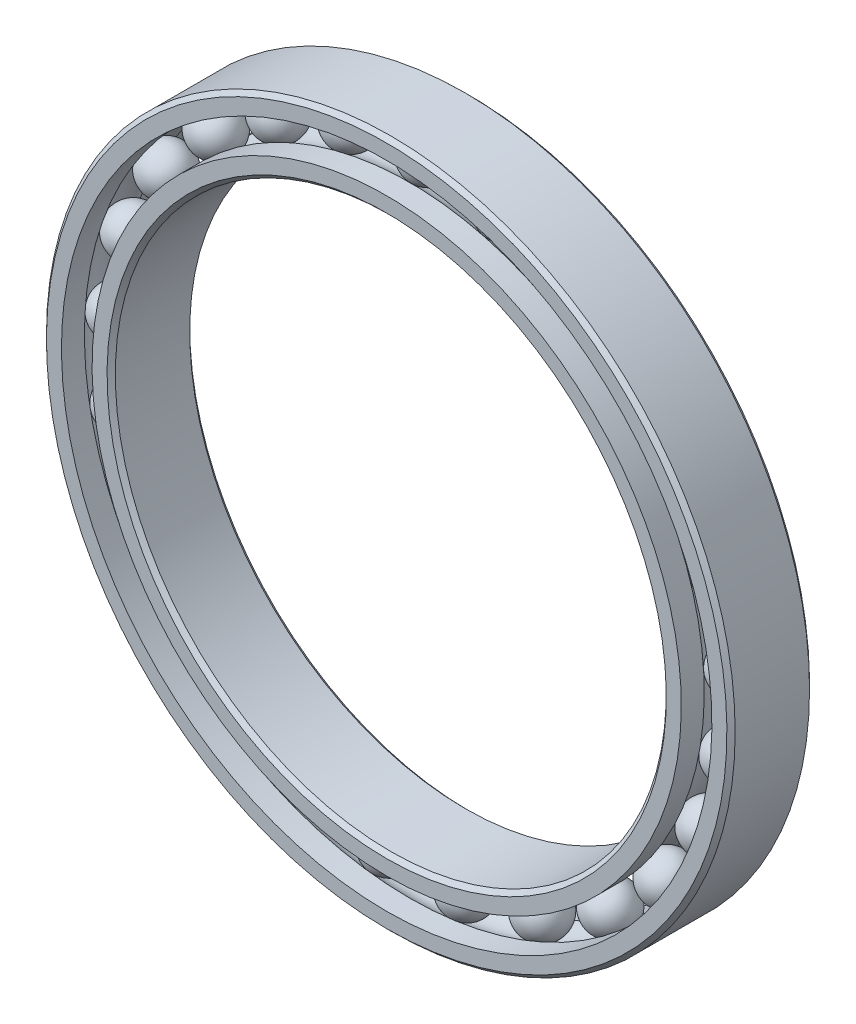
ISO-10303-21;
HEADER;
FILE_DESCRIPTION(('STEP AP214'),'2;1');
FILE_NAME('part.step','',(''),(''),'','','');
FILE_SCHEMA(('AUTOMOTIVE_DESIGN { 1 0 10303 214 1 1 1 1 }'));
ENDSEC;
DATA;
#1=APPLICATION_CONTEXT('core data for automotive mechanical design processes');
#2=APPLICATION_PROTOCOL_DEFINITION('international standard','automotive_design',2000,#1);
#3=PRODUCT_CONTEXT('',#1,'mechanical');
#4=PRODUCT('Part','Part','',(#3));
#5=PRODUCT_RELATED_PRODUCT_CATEGORY('part','',(#4));
#6=PRODUCT_DEFINITION_FORMATION('','',#4);
#7=PRODUCT_DEFINITION_CONTEXT('part definition',#1,'design');
#8=PRODUCT_DEFINITION('design','',#6,#7);
#9=PRODUCT_DEFINITION_SHAPE('','',#8);
#10=(LENGTH_UNIT() NAMED_UNIT(*) SI_UNIT(.MILLI.,.METRE.));
#11=(NAMED_UNIT(*) PLANE_ANGLE_UNIT() SI_UNIT($,.RADIAN.));
#12=(NAMED_UNIT(*) SI_UNIT($,.STERADIAN.) SOLID_ANGLE_UNIT());
#13=UNCERTAINTY_MEASURE_WITH_UNIT(LENGTH_MEASURE(1.E-05),#10,'distance_accuracy_value','');
#14=(GEOMETRIC_REPRESENTATION_CONTEXT(3) GLOBAL_UNCERTAINTY_ASSIGNED_CONTEXT((#13)) GLOBAL_UNIT_ASSIGNED_CONTEXT((#10,
#11,#12)) REPRESENTATION_CONTEXT('',''));
#15=CARTESIAN_POINT('',(0.,0.,0.));
#16=DIRECTION('',(0.,0.,1.));
#17=DIRECTION('',(1.,0.,0.));
#18=AXIS2_PLACEMENT_3D('',#15,#16,#17);
#19=CARTESIAN_POINT('',(5.59552246120893,21.7931211253943,0.));
#20=DIRECTION('',(0.,0.,1.));
#21=DIRECTION('',(0.248689887164842,0.968583161128635,0.));
#22=AXIS2_PLACEMENT_3D('',#19,#20,#21);
#23=SPHERICAL_SURFACE('',#22,1.73561103909037);
#24=CARTESIAN_POINT('',(5.59552246120893,21.7931211253943,1.73561103909036));
#25=VERTEX_POINT('',#24);
#26=VERTEX_LOOP('',#25);
#27=FACE_BOUND('',#26,.T.);
#28=ADVANCED_FACE('F48',(#27),#23,.T.);
#29=CLOSED_SHELL('',(#28));
#30=MANIFOLD_SOLID_BREP('B2',#29);
#31=CARTESIAN_POINT('',(10.8394576672883,19.7169003009871,0.));
#32=DIRECTION('',(0.,0.,1.));
#33=DIRECTION('',(0.481753674101704,0.87630668004387,0.));
#34=AXIS2_PLACEMENT_3D('',#31,#32,#33);
#35=SPHERICAL_SURFACE('',#34,1.73561103909037);
#36=CARTESIAN_POINT('',(10.8394576672883,19.7169003009871,1.73561103909036));
#37=VERTEX_POINT('',#36);
#38=VERTEX_LOOP('',#37);
#39=FACE_BOUND('',#38,.T.);
#40=ADVANCED_FACE('F65',(#39),#35,.T.);
#41=CLOSED_SHELL('',(#40));
#42=MANIFOLD_SOLID_BREP('B6',#41);
#43=CARTESIAN_POINT('',(15.4023098833953,16.401794116982,0.));
#44=DIRECTION('',(0.,0.,1.));
#45=DIRECTION('',(0.684547105928679,0.72896862742142,0.));
#46=AXIS2_PLACEMENT_3D('',#43,#44,#45);
#47=SPHERICAL_SURFACE('',#46,1.73561103909037);
#48=CARTESIAN_POINT('',(15.4023098833953,16.401794116982,1.73561103909036));
#49=VERTEX_POINT('',#48);
#50=VERTEX_LOOP('',#49);
#51=FACE_BOUND('',#50,.T.);
#52=ADVANCED_FACE('F82',(#51),#47,.T.);
#53=CLOSED_SHELL('',(#52));
#54=MANIFOLD_SOLID_BREP('B44',#53);
#55=CARTESIAN_POINT('',(18.9973783237952,12.0561028870276,0.));
#56=DIRECTION('',(0.,0.,1.));
#57=DIRECTION('',(0.844327925502009,0.535826794979007,0.));
#58=AXIS2_PLACEMENT_3D('',#55,#56,#57);
#59=SPHERICAL_SURFACE('',#58,1.73561103909037);
#60=CARTESIAN_POINT('',(18.9973783237952,12.0561028870276,1.73561103909036));
#61=VERTEX_POINT('',#60);
#62=VERTEX_LOOP('',#61);
#63=FACE_BOUND('',#62,.T.);
#64=ADVANCED_FACE('F99',(#63),#59,.T.);
#65=CLOSED_SHELL('',(#64));
#66=MANIFOLD_SOLID_BREP('B61',#65);
#67=CARTESIAN_POINT('',(21.3987716166409,6.95288237343656,0.));
#68=DIRECTION('',(0.,0.,1.));
#69=DIRECTION('',(0.95105651629515,0.309016994374958,0.));
#70=AXIS2_PLACEMENT_3D('',#67,#68,#69);
#71=SPHERICAL_SURFACE('',#70,1.73561103909037);
#72=CARTESIAN_POINT('',(21.3987716166409,6.95288237343656,1.73561103909036));
#73=VERTEX_POINT('',#72);
#74=VERTEX_LOOP('',#73);
#75=FACE_BOUND('',#74,.T.);
#76=ADVANCED_FACE('F116',(#75),#71,.T.);
#77=CLOSED_SHELL('',(#76));
#78=MANIFOLD_SOLID_BREP('B78',#77);
#79=CARTESIAN_POINT('',(22.4556013896361,1.4127866894098,0.));
#80=DIRECTION('',(0.,0.,1.));
#81=DIRECTION('',(0.998026728428271,0.0627905195293244,0.));
#82=AXIS2_PLACEMENT_3D('',#79,#80,#81);
#83=SPHERICAL_SURFACE('',#82,1.73561103909037);
#84=CARTESIAN_POINT('',(22.4556013896361,1.4127866894098,1.73561103909036));
#85=VERTEX_POINT('',#84);
#86=VERTEX_LOOP('',#85);
#87=FACE_BOUND('',#86,.T.);
#88=ADVANCED_FACE('F133',(#87),#83,.T.);
#89=CLOSED_SHELL('',(#88));
#90=MANIFOLD_SOLID_BREP('B95',#89);
#91=CARTESIAN_POINT('',(22.1014631413955,-4.21607957817859,0.));
#92=DIRECTION('',(0.,0.,1.));
#93=DIRECTION('',(0.982287250728691,-0.187381314585715,0.));
#94=AXIS2_PLACEMENT_3D('',#91,#92,#93);
#95=SPHERICAL_SURFACE('',#94,1.73561103909037);
#96=CARTESIAN_POINT('',(22.1014631413955,-4.21607957817859,1.73561103909036));
#97=VERTEX_POINT('',#96);
#98=VERTEX_LOOP('',#97);
#99=FACE_BOUND('',#98,.T.);
#100=ADVANCED_FACE('F150',(#99),#95,.T.);
#101=CLOSED_SHELL('',(#100));
#102=MANIFOLD_SOLID_BREP('B112',#101);
#103=CARTESIAN_POINT('',(20.3586086804855,-9.58003406021394,0.));
#104=DIRECTION('',(0.,0.,1.));
#105=DIRECTION('',(0.904827052466024,-0.425779291565064,0.));
#106=AXIS2_PLACEMENT_3D('',#103,#104,#105);
#107=SPHERICAL_SURFACE('',#106,1.73561103909037);
#108=CARTESIAN_POINT('',(20.3586086804855,-9.58003406021394,1.73561103909036));
#109=VERTEX_POINT('',#108);
#110=VERTEX_LOOP('',#109);
#111=FACE_BOUND('',#110,.T.);
#112=ADVANCED_FACE('F167',(#111),#107,.T.);
#113=CLOSED_SHELL('',(#112));
#114=MANIFOLD_SOLID_BREP('B129',#113);
#115=CARTESIAN_POINT('',(17.3365479624554,-14.3420397693454,0.));
#116=DIRECTION('',(0.,0.,1.));
#117=DIRECTION('',(0.770513242775795,-0.637423989748683,0.));
#118=AXIS2_PLACEMENT_3D('',#115,#116,#117);
#119=SPHERICAL_SURFACE('',#118,1.73561103909037);
#120=CARTESIAN_POINT('',(17.3365479624554,-14.3420397693454,1.73561103909036));
#121=VERTEX_POINT('',#120);
#122=VERTEX_LOOP('',#121);
#123=FACE_BOUND('',#122,.T.);
#124=ADVANCED_FACE('F184',(#123),#119,.T.);
#125=CLOSED_SHELL('',(#124));
#126=MANIFOLD_SOLID_BREP('B146',#125);
#127=CARTESIAN_POINT('',(13.2251681765808,-18.2028823734362,0.));
#128=DIRECTION('',(0.,0.,1.));
#129=DIRECTION('',(0.58778525229248,-0.809016994374942,0.));
#130=AXIS2_PLACEMENT_3D('',#127,#128,#129);
#131=SPHERICAL_SURFACE('',#130,1.73561103909037);
#132=CARTESIAN_POINT('',(13.2251681765808,-18.2028823734362,1.73561103909036));
#133=VERTEX_POINT('',#132);
#134=VERTEX_LOOP('',#133);
#135=FACE_BOUND('',#134,.T.);
#136=ADVANCED_FACE('F201',(#135),#131,.T.);
#137=CLOSED_SHELL('',(#136));
#138=MANIFOLD_SOLID_BREP('B163',#137);
#139=CARTESIAN_POINT('',(8.28280243540542,-20.9199709324856,0.));
#140=DIRECTION('',(0.,0.,1.));
#141=DIRECTION('',(0.368124552684685,-0.929776485888248,0.));
#142=AXIS2_PLACEMENT_3D('',#139,#140,#141);
#143=SPHERICAL_SURFACE('',#142,1.73561103909037);
#144=CARTESIAN_POINT('',(8.28280243540542,-20.9199709324856,1.73561103909036));
#145=VERTEX_POINT('',#144);
#146=VERTEX_LOOP('',#145);
#147=FACE_BOUND('',#146,.T.);
#148=ADVANCED_FACE('F218',(#147),#143,.T.);
#149=CLOSED_SHELL('',(#148));
#150=MANIFOLD_SOLID_BREP('B180',#149);
#151=CARTESIAN_POINT('',(2.81999775519701,-22.3225807795757,0.));
#152=DIRECTION('',(0.,0.,1.));
#153=DIRECTION('',(0.125333233564311,-0.992114701314477,0.));
#154=AXIS2_PLACEMENT_3D('',#151,#152,#153);
#155=SPHERICAL_SURFACE('',#154,1.73561103909037);
#156=CARTESIAN_POINT('',(2.81999775519701,-22.3225807795757,1.73561103909036));
#157=VERTEX_POINT('',#156);
#158=VERTEX_LOOP('',#157);
#159=FACE_BOUND('',#158,.T.);
#160=ADVANCED_FACE('F235',(#159),#155,.T.);
#161=CLOSED_SHELL('',(#160));
#162=MANIFOLD_SOLID_BREP('B197',#161);
#163=CARTESIAN_POINT('',(-2.81999775519669,-22.3225807795758,0.));
#164=DIRECTION('',(0.,0.,1.));
#165=DIRECTION('',(-0.125333233564297,-0.992114701314479,0.));
#166=AXIS2_PLACEMENT_3D('',#163,#164,#165);
#167=SPHERICAL_SURFACE('',#166,1.73561103909037);
#168=CARTESIAN_POINT('',(-2.81999775519669,-22.3225807795758,1.73561103909036));
#169=VERTEX_POINT('',#168);
#170=VERTEX_LOOP('',#169);
#171=FACE_BOUND('',#170,.T.);
#172=ADVANCED_FACE('F252',(#171),#167,.T.);
#173=CLOSED_SHELL('',(#172));
#174=MANIFOLD_SOLID_BREP('B214',#173);
#175=CARTESIAN_POINT('',(-8.28280243540512,-20.9199709324857,0.));
#176=DIRECTION('',(0.,0.,1.));
#177=DIRECTION('',(-0.368124552684672,-0.929776485888254,0.));
#178=AXIS2_PLACEMENT_3D('',#175,#176,#177);
#179=SPHERICAL_SURFACE('',#178,1.73561103909037);
#180=CARTESIAN_POINT('',(-8.28280243540512,-20.9199709324857,1.73561103909036));
#181=VERTEX_POINT('',#180);
#182=VERTEX_LOOP('',#181);
#183=FACE_BOUND('',#182,.T.);
#184=ADVANCED_FACE('F269',(#183),#179,.T.);
#185=CLOSED_SHELL('',(#184));
#186=MANIFOLD_SOLID_BREP('B231',#185);
#187=CARTESIAN_POINT('',(-13.2251681765805,-18.2028823734364,0.));
#188=DIRECTION('',(0.,0.,1.));
#189=DIRECTION('',(-0.587785252292469,-0.809016994374951,0.));
#190=AXIS2_PLACEMENT_3D('',#187,#188,#189);
#191=SPHERICAL_SURFACE('',#190,1.73561103909037);
#192=CARTESIAN_POINT('',(-13.2251681765805,-18.2028823734364,1.73561103909036));
#193=VERTEX_POINT('',#192);
#194=VERTEX_LOOP('',#193);
#195=FACE_BOUND('',#194,.T.);
#196=ADVANCED_FACE('F286',(#195),#191,.T.);
#197=CLOSED_SHELL('',(#196));
#198=MANIFOLD_SOLID_BREP('B248',#197);
#199=CARTESIAN_POINT('',(-17.3365479624552,-14.3420397693456,0.));
#200=DIRECTION('',(0.,0.,1.));
#201=DIRECTION('',(-0.770513242775786,-0.637423989748694,0.));
#202=AXIS2_PLACEMENT_3D('',#199,#200,#201);
#203=SPHERICAL_SURFACE('',#202,1.73561103909037);
#204=CARTESIAN_POINT('',(-17.3365479624552,-14.3420397693456,1.73561103909036));
#205=VERTEX_POINT('',#204);
#206=VERTEX_LOOP('',#205);
#207=FACE_BOUND('',#206,.T.);
#208=ADVANCED_FACE('F303',(#207),#203,.T.);
#209=CLOSED_SHELL('',(#208));
#210=MANIFOLD_SOLID_BREP('B265',#209);
#211=CARTESIAN_POINT('',(-20.3586086804854,-9.58003406021423,0.));
#212=DIRECTION('',(0.,0.,1.));
#213=DIRECTION('',(-0.904827052466018,-0.425779291565077,0.));
#214=AXIS2_PLACEMENT_3D('',#211,#212,#213);
#215=SPHERICAL_SURFACE('',#214,1.73561103909037);
#216=CARTESIAN_POINT('',(-20.3586086804854,-9.58003406021423,1.73561103909036));
#217=VERTEX_POINT('',#216);
#218=VERTEX_LOOP('',#217);
#219=FACE_BOUND('',#218,.T.);
#220=ADVANCED_FACE('F320',(#219),#215,.T.);
#221=CLOSED_SHELL('',(#220));
#222=MANIFOLD_SOLID_BREP('B282',#221);
#223=CARTESIAN_POINT('',(-22.1014631413955,-4.21607957817889,0.));
#224=DIRECTION('',(0.,0.,1.));
#225=DIRECTION('',(-0.982287250728688,-0.187381314585729,0.));
#226=AXIS2_PLACEMENT_3D('',#223,#224,#225);
#227=SPHERICAL_SURFACE('',#226,1.73561103909037);
#228=CARTESIAN_POINT('',(-22.1014631413955,-4.21607957817889,1.73561103909036));
#229=VERTEX_POINT('',#228);
#230=VERTEX_LOOP('',#229);
#231=FACE_BOUND('',#230,.T.);
#232=ADVANCED_FACE('F337',(#231),#227,.T.);
#233=CLOSED_SHELL('',(#232));
#234=MANIFOLD_SOLID_BREP('B299',#233);
#235=CARTESIAN_POINT('',(-22.4556013896361,1.41278668940947,0.));
#236=DIRECTION('',(0.,0.,1.));
#237=DIRECTION('',(-0.998026728428272,0.06279051952931,0.));
#238=AXIS2_PLACEMENT_3D('',#235,#236,#237);
#239=SPHERICAL_SURFACE('',#238,1.73561103909037);
#240=CARTESIAN_POINT('',(-22.4556013896361,1.41278668940947,1.73561103909036));
#241=VERTEX_POINT('',#240);
#242=VERTEX_LOOP('',#241);
#243=FACE_BOUND('',#242,.T.);
#244=ADVANCED_FACE('F354',(#243),#239,.T.);
#245=CLOSED_SHELL('',(#244));
#246=MANIFOLD_SOLID_BREP('B316',#245);
#247=CARTESIAN_POINT('',(-21.398771616641,6.95288237343626,0.));
#248=DIRECTION('',(0.,0.,1.));
#249=DIRECTION('',(-0.951056516295155,0.309016994374945,0.));
#250=AXIS2_PLACEMENT_3D('',#247,#248,#249);
#251=SPHERICAL_SURFACE('',#250,1.73561103909037);
#252=CARTESIAN_POINT('',(-21.398771616641,6.95288237343626,1.73561103909036));
#253=VERTEX_POINT('',#252);
#254=VERTEX_LOOP('',#253);
#255=FACE_BOUND('',#254,.T.);
#256=ADVANCED_FACE('F371',(#255),#251,.T.);
#257=CLOSED_SHELL('',(#256));
#258=MANIFOLD_SOLID_BREP('B333',#257);
#259=CARTESIAN_POINT('',(-18.9973783237954,12.0561028870274,0.));
#260=DIRECTION('',(0.,0.,1.));
#261=DIRECTION('',(-0.844327925502017,0.535826794978995,0.));
#262=AXIS2_PLACEMENT_3D('',#259,#260,#261);
#263=SPHERICAL_SURFACE('',#262,1.73561103909037);
#264=CARTESIAN_POINT('',(-18.9973783237954,12.0561028870274,1.73561103909036));
#265=VERTEX_POINT('',#264);
#266=VERTEX_LOOP('',#265);
#267=FACE_BOUND('',#266,.T.);
#268=ADVANCED_FACE('F388',(#267),#263,.T.);
#269=CLOSED_SHELL('',(#268));
#270=MANIFOLD_SOLID_BREP('B350',#269);
#271=CARTESIAN_POINT('',(-15.4023098833955,16.4017941169817,0.));
#272=DIRECTION('',(0.,0.,1.));
#273=DIRECTION('',(-0.68454710592869,0.72896862742141,0.));
#274=AXIS2_PLACEMENT_3D('',#271,#272,#273);
#275=SPHERICAL_SURFACE('',#274,1.73561103909037);
#276=CARTESIAN_POINT('',(-15.4023098833955,16.4017941169817,1.73561103909036));
#277=VERTEX_POINT('',#276);
#278=VERTEX_LOOP('',#277);
#279=FACE_BOUND('',#278,.T.);
#280=ADVANCED_FACE('F405',(#279),#275,.T.);
#281=CLOSED_SHELL('',(#280));
#282=MANIFOLD_SOLID_BREP('B367',#281);
#283=CARTESIAN_POINT('',(-10.8394576672886,19.7169003009869,0.));
#284=DIRECTION('',(0.,0.,1.));
#285=DIRECTION('',(-0.481753674101716,0.876306680043863,0.));
#286=AXIS2_PLACEMENT_3D('',#283,#284,#285);
#287=SPHERICAL_SURFACE('',#286,1.73561103909037);
#288=CARTESIAN_POINT('',(-10.8394576672886,19.7169003009869,1.73561103909036));
#289=VERTEX_POINT('',#288);
#290=VERTEX_LOOP('',#289);
#291=FACE_BOUND('',#290,.T.);
#292=ADVANCED_FACE('F422',(#291),#287,.T.);
#293=CLOSED_SHELL('',(#292));
#294=MANIFOLD_SOLID_BREP('B384',#293);
#295=CARTESIAN_POINT('',(-5.59552246120924,21.7931211253942,0.));
#296=DIRECTION('',(0.,0.,1.));
#297=DIRECTION('',(-0.248689887164855,0.968583161128631,0.));
#298=AXIS2_PLACEMENT_3D('',#295,#296,#297);
#299=SPHERICAL_SURFACE('',#298,1.73561103909037);
#300=CARTESIAN_POINT('',(-5.59552246120924,21.7931211253942,1.73561103909036));
#301=VERTEX_POINT('',#300);
#302=VERTEX_LOOP('',#301);
#303=FACE_BOUND('',#302,.T.);
#304=ADVANCED_FACE('F439',(#303),#299,.T.);
#305=CLOSED_SHELL('',(#304));
#306=MANIFOLD_SOLID_BREP('B401',#305);
#307=CARTESIAN_POINT('',(0.,22.5,0.));
#308=DIRECTION('',(0.,0.,1.));
#309=DIRECTION('',(0.,1.,0.));
#310=AXIS2_PLACEMENT_3D('',#307,#308,#309);
#311=SPHERICAL_SURFACE('',#310,1.73561103909037);
#312=CARTESIAN_POINT('',(0.,22.5,1.73561103909036));
#313=VERTEX_POINT('',#312);
#314=VERTEX_LOOP('',#313);
#315=FACE_BOUND('',#314,.T.);
#316=ADVANCED_FACE('F458',(#315),#311,.T.);
#317=CLOSED_SHELL('',(#316));
#318=MANIFOLD_SOLID_BREP('B418',#317);
#319=CARTESIAN_POINT('',(0.,21.3888888888889,3.));
#320=DIRECTION('',(0.,0.,-1.));
#321=DIRECTION('',(0.,1.,0.));
#322=AXIS2_PLACEMENT_3D('',#319,#320,#321);
#323=PLANE('',#322);
#324=CARTESIAN_POINT('',(0.,0.,3.));
#325=DIRECTION('',(0.,0.,1.));
#326=DIRECTION('',(0.,-1.,0.));
#327=AXIS2_PLACEMENT_3D('',#324,#325,#326);
#328=CIRCLE('',#327,20.3);
#329=CARTESIAN_POINT('',(0.,-20.3,3.));
#330=VERTEX_POINT('',#329);
#331=EDGE_CURVE('E504',#330,#330,#328,.T.);
#332=ORIENTED_EDGE('',*,*,#331,.F.);
#333=EDGE_LOOP('',(#332));
#334=FACE_BOUND('',#333,.T.);
#335=CARTESIAN_POINT('',(0.,0.,3.));
#336=DIRECTION('',(0.,0.,1.));
#337=DIRECTION('',(0.,-1.,0.));
#338=AXIS2_PLACEMENT_3D('',#335,#336,#337);
#339=CIRCLE('',#338,21.3888888888889);
#340=CARTESIAN_POINT('',(0.,-21.3888888888889,3.));
#341=VERTEX_POINT('',#340);
#342=EDGE_CURVE('E457',#341,#341,#339,.T.);
#343=ORIENTED_EDGE('',*,*,#342,.T.);
#344=EDGE_LOOP('',(#343));
#345=FACE_BOUND('',#344,.T.);
#346=ADVANCED_FACE('F476',(#334,#345),#323,.F.);
#347=CARTESIAN_POINT('',(0.,0.,2.99999999999999));
#348=DIRECTION('',(0.,0.,1.));
#349=DIRECTION('',(0.,-1.,0.));
#350=AXIS2_PLACEMENT_3D('',#347,#348,#349);
#351=CYLINDRICAL_SURFACE('',#350,21.3888888888889);
#352=ORIENTED_EDGE('',*,*,#342,.F.);
#353=EDGE_LOOP('',(#352));
#354=FACE_BOUND('',#353,.T.);
#355=CARTESIAN_POINT('',(0.,0.,1.33333333333333));
#356=DIRECTION('',(0.,0.,1.));
#357=DIRECTION('',(0.,-1.,0.));
#358=AXIS2_PLACEMENT_3D('',#355,#356,#357);
#359=CIRCLE('',#358,21.3888888888889);
#360=CARTESIAN_POINT('',(0.,-21.3888888888889,1.33333333333332));
#361=VERTEX_POINT('',#360);
#362=EDGE_CURVE('E482',#361,#361,#359,.T.);
#363=ORIENTED_EDGE('',*,*,#362,.T.);
#364=EDGE_LOOP('',(#363));
#365=FACE_BOUND('',#364,.T.);
#366=ADVANCED_FACE('F511',(#354,#365),#351,.T.);
#367=CARTESIAN_POINT('',(0.,0.,0.));
#368=DIRECTION('',(0.,0.,1.));
#369=DIRECTION('',(0.,-1.,0.));
#370=AXIS2_PLACEMENT_3D('',#367,#368,#369);
#371=TOROIDAL_SURFACE('',#370,22.5,1.73561103909037);
#372=ORIENTED_EDGE('',*,*,#362,.F.);
#373=EDGE_LOOP('',(#372));
#374=FACE_BOUND('',#373,.T.);
#375=CARTESIAN_POINT('',(0.,0.,-1.33333333333333));
#376=DIRECTION('',(0.,0.,1.));
#377=DIRECTION('',(0.,-1.,0.));
#378=AXIS2_PLACEMENT_3D('',#375,#376,#377);
#379=CIRCLE('',#378,21.3888888888889);
#380=CARTESIAN_POINT('',(0.,-21.3888888888889,-1.33333333333333));
#381=VERTEX_POINT('',#380);
#382=EDGE_CURVE('E486',#381,#381,#379,.T.);
#383=ORIENTED_EDGE('',*,*,#382,.T.);
#384=EDGE_LOOP('',(#383));
#385=FACE_BOUND('',#384,.T.);
#386=ADVANCED_FACE('F515',(#374,#385),#371,.F.);
#387=CARTESIAN_POINT('',(0.,0.,2.99999999999999));
#388=DIRECTION('',(0.,0.,1.));
#389=DIRECTION('',(0.,-1.,0.));
#390=AXIS2_PLACEMENT_3D('',#387,#388,#389);
#391=CYLINDRICAL_SURFACE('',#390,21.3888888888889);
#392=ORIENTED_EDGE('',*,*,#382,.F.);
#393=EDGE_LOOP('',(#392));
#394=FACE_BOUND('',#393,.T.);
#395=CARTESIAN_POINT('',(0.,0.,-3.00000000000001));
#396=DIRECTION('',(0.,0.,1.));
#397=DIRECTION('',(0.,-1.,0.));
#398=AXIS2_PLACEMENT_3D('',#395,#396,#397);
#399=CIRCLE('',#398,21.3888888888889);
#400=CARTESIAN_POINT('',(0.,-21.3888888888889,-3.00000000000001));
#401=VERTEX_POINT('',#400);
#402=EDGE_CURVE('E490',#401,#401,#399,.T.);
#403=ORIENTED_EDGE('',*,*,#402,.T.);
#404=EDGE_LOOP('',(#403));
#405=FACE_BOUND('',#404,.T.);
#406=ADVANCED_FACE('F520',(#394,#405),#391,.T.);
#407=CARTESIAN_POINT('',(0.,20.3,-3.00000000000001));
#408=DIRECTION('',(0.,0.,1.));
#409=DIRECTION('',(0.,-1.,0.));
#410=AXIS2_PLACEMENT_3D('',#407,#408,#409);
#411=PLANE('',#410);
#412=ORIENTED_EDGE('',*,*,#402,.F.);
#413=EDGE_LOOP('',(#412));
#414=FACE_BOUND('',#413,.T.);
#415=CARTESIAN_POINT('',(0.,0.,-3.00000000000001));
#416=DIRECTION('',(0.,0.,1.));
#417=DIRECTION('',(0.,-1.,0.));
#418=AXIS2_PLACEMENT_3D('',#415,#416,#417);
#419=CIRCLE('',#418,20.3);
#420=CARTESIAN_POINT('',(0.,-20.3,-3.00000000000001));
#421=VERTEX_POINT('',#420);
#422=EDGE_CURVE('E495',#421,#421,#419,.T.);
#423=ORIENTED_EDGE('',*,*,#422,.T.);
#424=EDGE_LOOP('',(#423));
#425=FACE_BOUND('',#424,.T.);
#426=ADVANCED_FACE('F526',(#414,#425),#411,.F.);
#427=CARTESIAN_POINT('',(0.,0.,-2.70000000000001));
#428=DIRECTION('',(0.,0.,-1.));
#429=DIRECTION('',(0.,1.,0.));
#430=AXIS2_PLACEMENT_3D('',#427,#428,#429);
#431=CONICAL_SURFACE('',#430,20.,0.785398163397428);
#432=ORIENTED_EDGE('',*,*,#422,.F.);
#433=EDGE_LOOP('',(#432));
#434=FACE_BOUND('',#433,.T.);
#435=CARTESIAN_POINT('',(0.,0.,-2.70000000000001));
#436=DIRECTION('',(0.,0.,1.));
#437=DIRECTION('',(0.,-1.,0.));
#438=AXIS2_PLACEMENT_3D('',#435,#436,#437);
#439=CIRCLE('',#438,20.);
#440=CARTESIAN_POINT('',(0.,-20.,-2.70000000000001));
#441=VERTEX_POINT('',#440);
#442=EDGE_CURVE('E498',#441,#441,#439,.T.);
#443=ORIENTED_EDGE('',*,*,#442,.T.);
#444=EDGE_LOOP('',(#443));
#445=FACE_BOUND('',#444,.T.);
#446=ADVANCED_FACE('F530',(#434,#445),#431,.F.);
#447=CARTESIAN_POINT('',(0.,0.,2.99999999999999));
#448=DIRECTION('',(0.,0.,1.));
#449=DIRECTION('',(0.,-1.,0.));
#450=AXIS2_PLACEMENT_3D('',#447,#448,#449);
#451=CYLINDRICAL_SURFACE('',#450,20.);
#452=ORIENTED_EDGE('',*,*,#442,.F.);
#453=EDGE_LOOP('',(#452));
#454=FACE_BOUND('',#453,.T.);
#455=CARTESIAN_POINT('',(0.,0.,2.70000000000001));
#456=DIRECTION('',(0.,0.,1.));
#457=DIRECTION('',(0.,-1.,0.));
#458=AXIS2_PLACEMENT_3D('',#455,#456,#457);
#459=CIRCLE('',#458,20.);
#460=CARTESIAN_POINT('',(0.,-20.,2.70000000000001));
#461=VERTEX_POINT('',#460);
#462=EDGE_CURVE('E501',#461,#461,#459,.T.);
#463=ORIENTED_EDGE('',*,*,#462,.T.);
#464=EDGE_LOOP('',(#463));
#465=FACE_BOUND('',#464,.T.);
#466=ADVANCED_FACE('F534',(#454,#465),#451,.F.);
#467=CARTESIAN_POINT('',(0.,0.,3.));
#468=DIRECTION('',(0.,0.,1.));
#469=DIRECTION('',(0.,-1.,0.));
#470=AXIS2_PLACEMENT_3D('',#467,#468,#469);
#471=CONICAL_SURFACE('',#470,20.3,0.785398163397469);
#472=ORIENTED_EDGE('',*,*,#462,.F.);
#473=EDGE_LOOP('',(#472));
#474=FACE_BOUND('',#473,.T.);
#475=ORIENTED_EDGE('',*,*,#331,.T.);
#476=EDGE_LOOP('',(#475));
#477=FACE_BOUND('',#476,.T.);
#478=ADVANCED_FACE('F508',(#474,#477),#471,.F.);
#479=CLOSED_SHELL('',(#346,#366,#386,#406,#426,#446,#466,#478));
#480=MANIFOLD_SOLID_BREP('B435',#479);
#481=CARTESIAN_POINT('',(0.,0.,2.99999999999999));
#482=DIRECTION('',(0.,0.,1.));
#483=DIRECTION('',(0.,-1.,0.));
#484=AXIS2_PLACEMENT_3D('',#481,#482,#483);
#485=CYLINDRICAL_SURFACE('',#484,25.);
#486=CARTESIAN_POINT('',(0.,0.,2.7));
#487=DIRECTION('',(0.,0.,1.));
#488=DIRECTION('',(0.,-1.,0.));
#489=AXIS2_PLACEMENT_3D('',#486,#487,#488);
#490=CIRCLE('',#489,25.);
#491=CARTESIAN_POINT('',(0.,-25.,2.69999999999999));
#492=VERTEX_POINT('',#491);
#493=EDGE_CURVE('E475',#492,#492,#490,.T.);
#494=ORIENTED_EDGE('',*,*,#493,.F.);
#495=EDGE_LOOP('',(#494));
#496=FACE_BOUND('',#495,.T.);
#497=CARTESIAN_POINT('',(0.,0.,-2.70000000000001));
#498=DIRECTION('',(0.,0.,1.));
#499=DIRECTION('',(0.,-1.,0.));
#500=AXIS2_PLACEMENT_3D('',#497,#498,#499);
#501=CIRCLE('',#500,25.);
#502=CARTESIAN_POINT('',(0.,-25.,-2.70000000000002));
#503=VERTEX_POINT('',#502);
#504=EDGE_CURVE('E617',#503,#503,#501,.T.);
#505=ORIENTED_EDGE('',*,*,#504,.T.);
#506=EDGE_LOOP('',(#505));
#507=FACE_BOUND('',#506,.T.);
#508=ADVANCED_FACE('F582',(#496,#507),#485,.T.);
#509=CARTESIAN_POINT('',(0.,0.,2.7));
#510=DIRECTION('',(0.,0.,-1.));
#511=DIRECTION('',(0.,1.,0.));
#512=AXIS2_PLACEMENT_3D('',#509,#510,#511);
#513=CONICAL_SURFACE('',#512,25.,0.785398163397447);
#514=CARTESIAN_POINT('',(0.,0.,2.99999999999999));
#515=DIRECTION('',(0.,0.,1.));
#516=DIRECTION('',(0.,-1.,0.));
#517=AXIS2_PLACEMENT_3D('',#514,#515,#516);
#518=CIRCLE('',#517,24.7);
#519=CARTESIAN_POINT('',(0.,-24.7,2.99999999999999));
#520=VERTEX_POINT('',#519);
#521=EDGE_CURVE('E589',#520,#520,#518,.T.);
#522=ORIENTED_EDGE('',*,*,#521,.F.);
#523=EDGE_LOOP('',(#522));
#524=FACE_BOUND('',#523,.T.);
#525=ORIENTED_EDGE('',*,*,#493,.T.);
#526=EDGE_LOOP('',(#525));
#527=FACE_BOUND('',#526,.T.);
#528=ADVANCED_FACE('F655',(#524,#527),#513,.T.);
#529=CARTESIAN_POINT('',(0.,24.7,2.99999999999999));
#530=DIRECTION('',(0.,0.,-1.));
#531=DIRECTION('',(0.,1.,0.));
#532=AXIS2_PLACEMENT_3D('',#529,#530,#531);
#533=PLANE('',#532);
#534=CARTESIAN_POINT('',(0.,0.,2.99999999999999));
#535=DIRECTION('',(0.,0.,1.));
#536=DIRECTION('',(0.,-1.,0.));
#537=AXIS2_PLACEMENT_3D('',#534,#535,#536);
#538=CIRCLE('',#537,23.6111111111111);
#539=CARTESIAN_POINT('',(0.,-23.6111111111111,2.99999999999999));
#540=VERTEX_POINT('',#539);
#541=EDGE_CURVE('E594',#540,#540,#538,.T.);
#542=ORIENTED_EDGE('',*,*,#541,.F.);
#543=EDGE_LOOP('',(#542));
#544=FACE_BOUND('',#543,.T.);
#545=ORIENTED_EDGE('',*,*,#521,.T.);
#546=EDGE_LOOP('',(#545));
#547=FACE_BOUND('',#546,.T.);
#548=ADVANCED_FACE('F650',(#544,#547),#533,.F.);
#549=CARTESIAN_POINT('',(0.,0.,2.99999999999999));
#550=DIRECTION('',(0.,0.,1.));
#551=DIRECTION('',(0.,-1.,0.));
#552=AXIS2_PLACEMENT_3D('',#549,#550,#551);
#553=CYLINDRICAL_SURFACE('',#552,23.6111111111111);
#554=CARTESIAN_POINT('',(0.,0.,1.33333333333333));
#555=DIRECTION('',(0.,0.,1.));
#556=DIRECTION('',(0.,-1.,0.));
#557=AXIS2_PLACEMENT_3D('',#554,#555,#556);
#558=CIRCLE('',#557,23.6111111111111);
#559=CARTESIAN_POINT('',(0.,-23.6111111111111,1.33333333333332));
#560=VERTEX_POINT('',#559);
#561=EDGE_CURVE('E599',#560,#560,#558,.T.);
#562=ORIENTED_EDGE('',*,*,#561,.F.);
#563=EDGE_LOOP('',(#562));
#564=FACE_BOUND('',#563,.T.);
#565=ORIENTED_EDGE('',*,*,#541,.T.);
#566=EDGE_LOOP('',(#565));
#567=FACE_BOUND('',#566,.T.);
#568=ADVANCED_FACE('F644',(#564,#567),#553,.F.);
#569=CARTESIAN_POINT('',(0.,0.,0.));
#570=DIRECTION('',(0.,0.,1.));
#571=DIRECTION('',(0.,-1.,0.));
#572=AXIS2_PLACEMENT_3D('',#569,#570,#571);
#573=TOROIDAL_SURFACE('',#572,22.5,1.73561103909037);
#574=CARTESIAN_POINT('',(0.,0.,-1.33333333333334));
#575=DIRECTION('',(0.,0.,1.));
#576=DIRECTION('',(0.,-1.,0.));
#577=AXIS2_PLACEMENT_3D('',#574,#575,#576);
#578=CIRCLE('',#577,23.6111111111111);
#579=CARTESIAN_POINT('',(0.,-23.6111111111111,-1.33333333333334));
#580=VERTEX_POINT('',#579);
#581=EDGE_CURVE('E605',#580,#580,#578,.T.);
#582=ORIENTED_EDGE('',*,*,#581,.F.);
#583=EDGE_LOOP('',(#582));
#584=FACE_BOUND('',#583,.T.);
#585=ORIENTED_EDGE('',*,*,#561,.T.);
#586=EDGE_LOOP('',(#585));
#587=FACE_BOUND('',#586,.T.);
#588=ADVANCED_FACE('F638',(#584,#587),#573,.F.);
#589=CARTESIAN_POINT('',(0.,0.,2.99999999999999));
#590=DIRECTION('',(0.,0.,1.));
#591=DIRECTION('',(0.,-1.,0.));
#592=AXIS2_PLACEMENT_3D('',#589,#590,#591);
#593=CYLINDRICAL_SURFACE('',#592,23.6111111111111);
#594=CARTESIAN_POINT('',(0.,0.,-3.));
#595=DIRECTION('',(0.,0.,1.));
#596=DIRECTION('',(0.,-1.,0.));
#597=AXIS2_PLACEMENT_3D('',#594,#595,#596);
#598=CIRCLE('',#597,23.6111111111111);
#599=CARTESIAN_POINT('',(0.,-23.6111111111111,-3.00000000000001));
#600=VERTEX_POINT('',#599);
#601=EDGE_CURVE('E609',#600,#600,#598,.T.);
#602=ORIENTED_EDGE('',*,*,#601,.F.);
#603=EDGE_LOOP('',(#602));
#604=FACE_BOUND('',#603,.T.);
#605=ORIENTED_EDGE('',*,*,#581,.T.);
#606=EDGE_LOOP('',(#605));
#607=FACE_BOUND('',#606,.T.);
#608=ADVANCED_FACE('F632',(#604,#607),#593,.F.);
#609=CARTESIAN_POINT('',(0.,24.7,-3.));
#610=DIRECTION('',(0.,0.,1.));
#611=DIRECTION('',(0.,-1.,0.));
#612=AXIS2_PLACEMENT_3D('',#609,#610,#611);
#613=PLANE('',#612);
#614=CARTESIAN_POINT('',(0.,0.,-3.00000000000001));
#615=DIRECTION('',(0.,0.,1.));
#616=DIRECTION('',(0.,-1.,0.));
#617=AXIS2_PLACEMENT_3D('',#614,#615,#616);
#618=CIRCLE('',#617,24.7);
#619=CARTESIAN_POINT('',(0.,-24.7,-3.00000000000001));
#620=VERTEX_POINT('',#619);
#621=EDGE_CURVE('E613',#620,#620,#618,.T.);
#622=ORIENTED_EDGE('',*,*,#621,.F.);
#623=EDGE_LOOP('',(#622));
#624=FACE_BOUND('',#623,.T.);
#625=ORIENTED_EDGE('',*,*,#601,.T.);
#626=EDGE_LOOP('',(#625));
#627=FACE_BOUND('',#626,.T.);
#628=ADVANCED_FACE('F626',(#624,#627),#613,.F.);
#629=CARTESIAN_POINT('',(0.,0.,-3.00000000000001));
#630=DIRECTION('',(0.,0.,1.));
#631=DIRECTION('',(0.,-1.,0.));
#632=AXIS2_PLACEMENT_3D('',#629,#630,#631);
#633=CONICAL_SURFACE('',#632,24.7,0.785398163397448);
#634=ORIENTED_EDGE('',*,*,#504,.F.);
#635=EDGE_LOOP('',(#634));
#636=FACE_BOUND('',#635,.T.);
#637=ORIENTED_EDGE('',*,*,#621,.T.);
#638=EDGE_LOOP('',(#637));
#639=FACE_BOUND('',#638,.T.);
#640=ADVANCED_FACE('F623',(#636,#639),#633,.T.);
#641=CLOSED_SHELL('',(#508,#528,#548,#568,#588,#608,#628,#640));
#642=MANIFOLD_SOLID_BREP('B452',#641);
#643=ADVANCED_BREP_SHAPE_REPRESENTATION('',(#18,#30,#42,#54,#66,#78,#90,#102,#114,#126,#138,
#150,#162,#174,#186,#198,#210,#222,#234,#246,#258,#270,#282,#294,#306,#318,#480,#642),#14);
#644=SHAPE_DEFINITION_REPRESENTATION(#9,#643);
ENDSEC;
END-ISO-10303-21;
